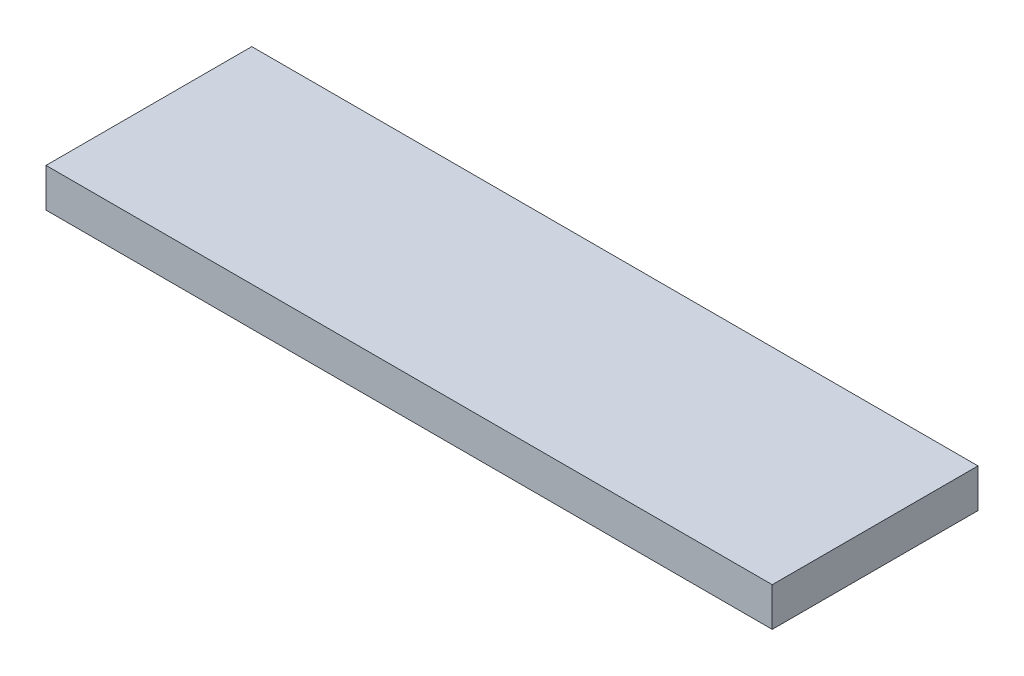
ISO-10303-21;
HEADER;
FILE_DESCRIPTION(('STEP AP214'),'2;1');
FILE_NAME('part.step','',(''),(''),'','','');
FILE_SCHEMA(('AUTOMOTIVE_DESIGN { 1 0 10303 214 1 1 1 1 }'));
ENDSEC;
DATA;
#1=APPLICATION_CONTEXT('core data for automotive mechanical design processes');
#2=APPLICATION_PROTOCOL_DEFINITION('international standard','automotive_design',2000,#1);
#3=PRODUCT_CONTEXT('',#1,'mechanical');
#4=PRODUCT('Part','Part','',(#3));
#5=PRODUCT_RELATED_PRODUCT_CATEGORY('part','',(#4));
#6=PRODUCT_DEFINITION_FORMATION('','',#4);
#7=PRODUCT_DEFINITION_CONTEXT('part definition',#1,'design');
#8=PRODUCT_DEFINITION('design','',#6,#7);
#9=PRODUCT_DEFINITION_SHAPE('','',#8);
#10=(LENGTH_UNIT() NAMED_UNIT(*) SI_UNIT(.MILLI.,.METRE.));
#11=(NAMED_UNIT(*) PLANE_ANGLE_UNIT() SI_UNIT($,.RADIAN.));
#12=(NAMED_UNIT(*) SI_UNIT($,.STERADIAN.) SOLID_ANGLE_UNIT());
#13=UNCERTAINTY_MEASURE_WITH_UNIT(LENGTH_MEASURE(1.E-05),#10,'distance_accuracy_value','');
#14=(GEOMETRIC_REPRESENTATION_CONTEXT(3) GLOBAL_UNCERTAINTY_ASSIGNED_CONTEXT((#13)) GLOBAL_UNIT_ASSIGNED_CONTEXT((#10,
#11,#12)) REPRESENTATION_CONTEXT('',''));
#15=CARTESIAN_POINT('',(0.,0.,0.));
#16=DIRECTION('',(0.,0.,1.));
#17=DIRECTION('',(1.,0.,0.));
#18=AXIS2_PLACEMENT_3D('',#15,#16,#17);
#19=CARTESIAN_POINT('',(0.,1.6,0.));
#20=DIRECTION('',(1.,0.,0.));
#21=DIRECTION('',(0.,0.,-1.));
#22=AXIS2_PLACEMENT_3D('',#19,#20,#21);
#23=PLANE('',#22);
#24=DIRECTION('',(0.,0.,1.));
#25=VECTOR('',#24,1.);
#26=CARTESIAN_POINT('',(0.,0.,0.));
#27=LINE('',#26,#25);
#28=CARTESIAN_POINT('',(0.,0.,-8.5));
#29=VERTEX_POINT('',#28);
#30=CARTESIAN_POINT('',(0.,0.,0.));
#31=VERTEX_POINT('',#30);
#32=EDGE_CURVE('E96',#29,#31,#27,.T.);
#33=ORIENTED_EDGE('',*,*,#32,.T.);
#34=DIRECTION('',(0.,-1.,0.));
#35=VECTOR('',#34,1.);
#36=CARTESIAN_POINT('',(0.,1.6,0.));
#37=LINE('',#36,#35);
#38=CARTESIAN_POINT('',(0.,1.6,0.));
#39=VERTEX_POINT('',#38);
#40=EDGE_CURVE('E11',#39,#31,#37,.T.);
#41=ORIENTED_EDGE('',*,*,#40,.F.);
#42=DIRECTION('',(0.,0.,1.));
#43=VECTOR('',#42,1.);
#44=CARTESIAN_POINT('',(0.,1.6,0.));
#45=LINE('',#44,#43);
#46=CARTESIAN_POINT('',(0.,1.6,-8.5));
#47=VERTEX_POINT('',#46);
#48=EDGE_CURVE('E84',#47,#39,#45,.T.);
#49=ORIENTED_EDGE('',*,*,#48,.F.);
#50=DIRECTION('',(0.,-1.,0.));
#51=VECTOR('',#50,1.);
#52=CARTESIAN_POINT('',(0.,1.6,-8.5));
#53=LINE('',#52,#51);
#54=EDGE_CURVE('E92',#47,#29,#53,.T.);
#55=ORIENTED_EDGE('',*,*,#54,.T.);
#56=EDGE_LOOP('',(#33,#41,#49,#55));
#57=FACE_BOUND('',#56,.T.);
#58=ADVANCED_FACE('F33',(#57),#23,.F.);
#59=CARTESIAN_POINT('',(0.,1.6,0.));
#60=DIRECTION('',(0.,0.,-1.));
#61=DIRECTION('',(-1.,0.,0.));
#62=AXIS2_PLACEMENT_3D('',#59,#60,#61);
#63=PLANE('',#62);
#64=DIRECTION('',(1.,0.,0.));
#65=VECTOR('',#64,1.);
#66=CARTESIAN_POINT('',(0.,0.,0.));
#67=LINE('',#66,#65);
#68=CARTESIAN_POINT('',(30.,0.,0.));
#69=VERTEX_POINT('',#68);
#70=EDGE_CURVE('E88',#31,#69,#67,.T.);
#71=ORIENTED_EDGE('',*,*,#70,.T.);
#72=DIRECTION('',(0.,-1.,0.));
#73=VECTOR('',#72,1.);
#74=CARTESIAN_POINT('',(30.,1.6,0.));
#75=LINE('',#74,#73);
#76=CARTESIAN_POINT('',(30.,1.6,0.));
#77=VERTEX_POINT('',#76);
#78=EDGE_CURVE('E41',#77,#69,#75,.T.);
#79=ORIENTED_EDGE('',*,*,#78,.F.);
#80=DIRECTION('',(1.,0.,0.));
#81=VECTOR('',#80,1.);
#82=CARTESIAN_POINT('',(0.,1.6,0.));
#83=LINE('',#82,#81);
#84=EDGE_CURVE('E79',#39,#77,#83,.T.);
#85=ORIENTED_EDGE('',*,*,#84,.F.);
#86=ORIENTED_EDGE('',*,*,#40,.T.);
#87=EDGE_LOOP('',(#71,#79,#85,#86));
#88=FACE_BOUND('',#87,.T.);
#89=ADVANCED_FACE('F87',(#88),#63,.F.);
#90=CARTESIAN_POINT('',(30.,1.6,0.));
#91=DIRECTION('',(-1.,0.,0.));
#92=DIRECTION('',(0.,0.,1.));
#93=AXIS2_PLACEMENT_3D('',#90,#91,#92);
#94=PLANE('',#93);
#95=DIRECTION('',(0.,0.,-1.));
#96=VECTOR('',#95,1.);
#97=CARTESIAN_POINT('',(30.,0.,0.));
#98=LINE('',#97,#96);
#99=CARTESIAN_POINT('',(30.,0.,-8.5));
#100=VERTEX_POINT('',#99);
#101=EDGE_CURVE('E66',#69,#100,#98,.T.);
#102=ORIENTED_EDGE('',*,*,#101,.T.);
#103=DIRECTION('',(0.,-1.,0.));
#104=VECTOR('',#103,1.);
#105=CARTESIAN_POINT('',(30.,1.6,-8.5));
#106=LINE('',#105,#104);
#107=CARTESIAN_POINT('',(30.,1.6,-8.5));
#108=VERTEX_POINT('',#107);
#109=EDGE_CURVE('E89',#108,#100,#106,.T.);
#110=ORIENTED_EDGE('',*,*,#109,.F.);
#111=DIRECTION('',(0.,0.,-1.));
#112=VECTOR('',#111,1.);
#113=CARTESIAN_POINT('',(30.,1.6,0.));
#114=LINE('',#113,#112);
#115=EDGE_CURVE('E82',#77,#108,#114,.T.);
#116=ORIENTED_EDGE('',*,*,#115,.F.);
#117=ORIENTED_EDGE('',*,*,#78,.T.);
#118=EDGE_LOOP('',(#102,#110,#116,#117));
#119=FACE_BOUND('',#118,.T.);
#120=ADVANCED_FACE('F90',(#119),#94,.F.);
#121=CARTESIAN_POINT('',(0.,1.6,-8.5));
#122=DIRECTION('',(0.,0.,1.));
#123=DIRECTION('',(1.,0.,0.));
#124=AXIS2_PLACEMENT_3D('',#121,#122,#123);
#125=PLANE('',#124);
#126=DIRECTION('',(-1.,0.,0.));
#127=VECTOR('',#126,1.);
#128=CARTESIAN_POINT('',(0.,0.,-8.5));
#129=LINE('',#128,#127);
#130=EDGE_CURVE('E72',#100,#29,#129,.T.);
#131=ORIENTED_EDGE('',*,*,#130,.T.);
#132=ORIENTED_EDGE('',*,*,#54,.F.);
#133=DIRECTION('',(-1.,0.,0.));
#134=VECTOR('',#133,1.);
#135=CARTESIAN_POINT('',(0.,1.6,-8.5));
#136=LINE('',#135,#134);
#137=EDGE_CURVE('E49',#108,#47,#136,.T.);
#138=ORIENTED_EDGE('',*,*,#137,.F.);
#139=ORIENTED_EDGE('',*,*,#109,.T.);
#140=EDGE_LOOP('',(#131,#132,#138,#139));
#141=FACE_BOUND('',#140,.T.);
#142=ADVANCED_FACE('F103',(#141),#125,.F.);
#143=CARTESIAN_POINT('',(0.,1.6,0.));
#144=DIRECTION('',(0.,-1.,0.));
#145=DIRECTION('',(0.,0.,-1.));
#146=AXIS2_PLACEMENT_3D('',#143,#144,#145);
#147=PLANE('',#146);
#148=ORIENTED_EDGE('',*,*,#48,.T.);
#149=ORIENTED_EDGE('',*,*,#84,.T.);
#150=ORIENTED_EDGE('',*,*,#115,.T.);
#151=ORIENTED_EDGE('',*,*,#137,.T.);
#152=EDGE_LOOP('',(#148,#149,#150,#151));
#153=FACE_BOUND('',#152,.T.);
#154=ADVANCED_FACE('F80',(#153),#147,.F.);
#155=CARTESIAN_POINT('',(0.,0.,0.));
#156=DIRECTION('',(0.,-1.,0.));
#157=DIRECTION('',(0.,0.,-1.));
#158=AXIS2_PLACEMENT_3D('',#155,#156,#157);
#159=PLANE('',#158);
#160=ORIENTED_EDGE('',*,*,#32,.F.);
#161=ORIENTED_EDGE('',*,*,#130,.F.);
#162=ORIENTED_EDGE('',*,*,#101,.F.);
#163=ORIENTED_EDGE('',*,*,#70,.F.);
#164=EDGE_LOOP('',(#160,#161,#162,#163));
#165=FACE_BOUND('',#164,.T.);
#166=ADVANCED_FACE('F106',(#165),#159,.T.);
#167=CLOSED_SHELL('',(#58,#89,#120,#142,#154,#166));
#168=MANIFOLD_SOLID_BREP('B2',#167);
#169=ADVANCED_BREP_SHAPE_REPRESENTATION('',(#18,#168),#14);
#170=SHAPE_DEFINITION_REPRESENTATION(#9,#169);
ENDSEC;
END-ISO-10303-21;
